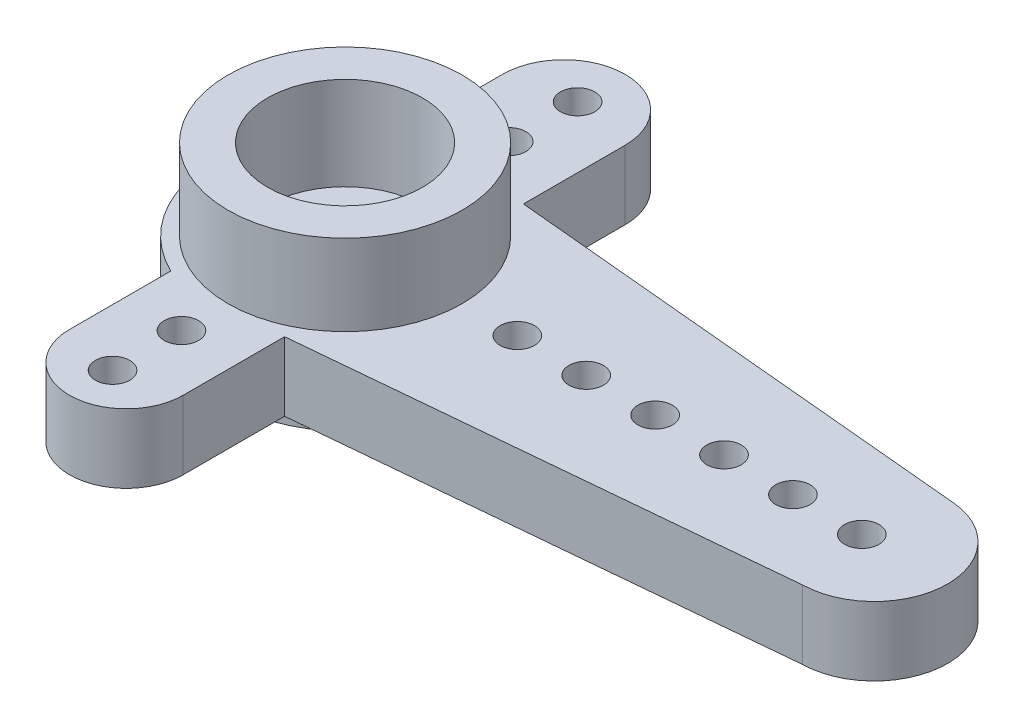
ISO-10303-21;
HEADER;
FILE_DESCRIPTION(('STEP AP214'),'2;1');
FILE_NAME('part.step','',(''),(''),'','','');
FILE_SCHEMA(('AUTOMOTIVE_DESIGN { 1 0 10303 214 1 1 1 1 }'));
ENDSEC;
DATA;
#1=APPLICATION_CONTEXT('core data for automotive mechanical design processes');
#2=APPLICATION_PROTOCOL_DEFINITION('international standard','automotive_design',2000,#1);
#3=PRODUCT_CONTEXT('',#1,'mechanical');
#4=PRODUCT('Part','Part','',(#3));
#5=PRODUCT_RELATED_PRODUCT_CATEGORY('part','',(#4));
#6=PRODUCT_DEFINITION_FORMATION('','',#4);
#7=PRODUCT_DEFINITION_CONTEXT('part definition',#1,'design');
#8=PRODUCT_DEFINITION('design','',#6,#7);
#9=PRODUCT_DEFINITION_SHAPE('','',#8);
#10=(LENGTH_UNIT() NAMED_UNIT(*) SI_UNIT(.MILLI.,.METRE.));
#11=(NAMED_UNIT(*) PLANE_ANGLE_UNIT() SI_UNIT($,.RADIAN.));
#12=(NAMED_UNIT(*) SI_UNIT($,.STERADIAN.) SOLID_ANGLE_UNIT());
#13=UNCERTAINTY_MEASURE_WITH_UNIT(LENGTH_MEASURE(1.E-05),#10,'distance_accuracy_value','');
#14=(GEOMETRIC_REPRESENTATION_CONTEXT(3) GLOBAL_UNCERTAINTY_ASSIGNED_CONTEXT((#13)) GLOBAL_UNIT_ASSIGNED_CONTEXT((#10,
#11,#12)) REPRESENTATION_CONTEXT('',''));
#15=CARTESIAN_POINT('',(0.,0.,0.));
#16=DIRECTION('',(0.,0.,1.));
#17=DIRECTION('',(1.,0.,0.));
#18=AXIS2_PLACEMENT_3D('',#15,#16,#17);
#19=CARTESIAN_POINT('',(0.,4.85,0.));
#20=DIRECTION('',(0.,-1.,0.));
#21=DIRECTION('',(0.,0.,-1.));
#22=AXIS2_PLACEMENT_3D('',#19,#20,#21);
#23=CYLINDRICAL_SURFACE('',#22,2.25);
#24=CARTESIAN_POINT('',(0.,0.,0.));
#25=DIRECTION('',(0.,1.,0.));
#26=DIRECTION('',(0.,0.,1.));
#27=AXIS2_PLACEMENT_3D('',#24,#25,#26);
#28=CIRCLE('',#27,2.25);
#29=CARTESIAN_POINT('',(0.,0.,2.25));
#30=VERTEX_POINT('',#29);
#31=EDGE_CURVE('E191',#30,#30,#28,.T.);
#32=ORIENTED_EDGE('',*,*,#31,.F.);
#33=EDGE_LOOP('',(#32));
#34=FACE_BOUND('',#33,.T.);
#35=CARTESIAN_POINT('',(0.,1.25,0.));
#36=DIRECTION('',(0.,1.,0.));
#37=DIRECTION('',(0.,0.,1.));
#38=AXIS2_PLACEMENT_3D('',#35,#36,#37);
#39=CIRCLE('',#38,2.25);
#40=CARTESIAN_POINT('',(0.,1.25,2.25));
#41=VERTEX_POINT('',#40);
#42=EDGE_CURVE('E217',#41,#41,#39,.T.);
#43=ORIENTED_EDGE('',*,*,#42,.T.);
#44=EDGE_LOOP('',(#43));
#45=FACE_BOUND('',#44,.T.);
#46=ADVANCED_FACE('F34',(#34,#45),#23,.F.);
#47=CARTESIAN_POINT('',(0.,4.85,0.));
#48=DIRECTION('',(0.,-1.,0.));
#49=DIRECTION('',(0.,0.,-1.));
#50=AXIS2_PLACEMENT_3D('',#47,#48,#49);
#51=CYLINDRICAL_SURFACE('',#50,3.4);
#52=CARTESIAN_POINT('',(0.,0.,0.));
#53=DIRECTION('',(0.,1.,0.));
#54=DIRECTION('',(0.,0.,1.));
#55=AXIS2_PLACEMENT_3D('',#52,#53,#54);
#56=CIRCLE('',#55,3.4);
#57=CARTESIAN_POINT('',(0.,0.,3.4));
#58=VERTEX_POINT('',#57);
#59=EDGE_CURVE('E195',#58,#58,#56,.T.);
#60=ORIENTED_EDGE('',*,*,#59,.T.);
#61=EDGE_LOOP('',(#60));
#62=FACE_BOUND('',#61,.T.);
#63=CARTESIAN_POINT('',(0.,0.5,0.));
#64=DIRECTION('',(0.,1.,0.));
#65=DIRECTION('',(0.,0.,1.));
#66=AXIS2_PLACEMENT_3D('',#63,#64,#65);
#67=CIRCLE('',#66,3.4);
#68=CARTESIAN_POINT('',(0.,0.5,3.4));
#69=VERTEX_POINT('',#68);
#70=EDGE_CURVE('E43',#69,#69,#67,.T.);
#71=ORIENTED_EDGE('',*,*,#70,.F.);
#72=EDGE_LOOP('',(#71));
#73=FACE_BOUND('',#72,.T.);
#74=ADVANCED_FACE('F202',(#62,#73),#51,.T.);
#75=CARTESIAN_POINT('',(0.,4.85,0.));
#76=DIRECTION('',(0.,1.,0.));
#77=DIRECTION('',(0.,0.,1.));
#78=AXIS2_PLACEMENT_3D('',#75,#76,#77);
#79=PLANE('',#78);
#80=CARTESIAN_POINT('',(0.,4.85,0.));
#81=DIRECTION('',(0.,1.,0.));
#82=DIRECTION('',(0.,0.,1.));
#83=AXIS2_PLACEMENT_3D('',#80,#81,#82);
#84=CIRCLE('',#83,3.4);
#85=CARTESIAN_POINT('',(0.,4.85,3.4));
#86=VERTEX_POINT('',#85);
#87=EDGE_CURVE('E188',#86,#86,#84,.T.);
#88=ORIENTED_EDGE('',*,*,#87,.T.);
#89=EDGE_LOOP('',(#88));
#90=FACE_BOUND('',#89,.T.);
#91=CARTESIAN_POINT('',(0.,4.85,0.));
#92=DIRECTION('',(0.,1.,0.));
#93=DIRECTION('',(0.,0.,1.));
#94=AXIS2_PLACEMENT_3D('',#91,#92,#93);
#95=CIRCLE('',#94,2.25);
#96=CARTESIAN_POINT('',(0.,4.85,2.25));
#97=VERTEX_POINT('',#96);
#98=EDGE_CURVE('E192',#97,#97,#95,.T.);
#99=ORIENTED_EDGE('',*,*,#98,.F.);
#100=EDGE_LOOP('',(#99));
#101=FACE_BOUND('',#100,.T.);
#102=ADVANCED_FACE('F208',(#90,#101),#79,.T.);
#103=CARTESIAN_POINT('',(0.,0.,0.));
#104=DIRECTION('',(0.,1.,0.));
#105=DIRECTION('',(0.,0.,1.));
#106=AXIS2_PLACEMENT_3D('',#103,#104,#105);
#107=PLANE('',#106);
#108=ORIENTED_EDGE('',*,*,#59,.F.);
#109=EDGE_LOOP('',(#108));
#110=FACE_BOUND('',#109,.T.);
#111=ORIENTED_EDGE('',*,*,#31,.T.);
#112=EDGE_LOOP('',(#111));
#113=FACE_BOUND('',#112,.T.);
#114=ADVANCED_FACE('F205',(#110,#113),#107,.F.);
#115=CARTESIAN_POINT('',(0.,2.5,0.));
#116=DIRECTION('',(0.,1.,0.));
#117=DIRECTION('',(0.,0.,1.));
#118=AXIS2_PLACEMENT_3D('',#115,#116,#117);
#119=CIRCLE('',#118,3.4);
#120=CARTESIAN_POINT('',(0.,2.5,3.4));
#121=VERTEX_POINT('',#120);
#122=EDGE_CURVE('E185',#121,#121,#119,.T.);
#123=ORIENTED_EDGE('',*,*,#122,.T.);
#124=EDGE_LOOP('',(#123));
#125=FACE_BOUND('',#124,.T.);
#126=ORIENTED_EDGE('',*,*,#87,.F.);
#127=EDGE_LOOP('',(#126));
#128=FACE_BOUND('',#127,.T.);
#129=ADVANCED_FACE('F36',(#125,#128),#51,.T.);
#130=CARTESIAN_POINT('',(0.,2.15,0.));
#131=DIRECTION('',(0.,1.,0.));
#132=DIRECTION('',(0.,0.,1.));
#133=AXIS2_PLACEMENT_3D('',#130,#131,#132);
#134=CIRCLE('',#133,2.25);
#135=CARTESIAN_POINT('',(0.,2.15,2.25));
#136=VERTEX_POINT('',#135);
#137=EDGE_CURVE('E11',#136,#136,#134,.T.);
#138=ORIENTED_EDGE('',*,*,#137,.F.);
#139=EDGE_LOOP('',(#138));
#140=FACE_BOUND('',#139,.T.);
#141=ORIENTED_EDGE('',*,*,#98,.T.);
#142=EDGE_LOOP('',(#141));
#143=FACE_BOUND('',#142,.T.);
#144=ADVANCED_FACE('F214',(#140,#143),#23,.F.);
#145=CARTESIAN_POINT('',(0.,2.5,-6.34999999965378));
#146=DIRECTION('',(0.,1.,0.));
#147=DIRECTION('',(0.,0.,1.));
#148=AXIS2_PLACEMENT_3D('',#145,#146,#147);
#149=PLANE('',#148);
#150=CARTESIAN_POINT('',(0.,2.5,-4.75));
#151=DIRECTION('',(0.,1.,0.));
#152=DIRECTION('',(0.,0.,1.));
#153=AXIS2_PLACEMENT_3D('',#150,#151,#152);
#154=CIRCLE('',#153,0.500000000000001);
#155=CARTESIAN_POINT('',(0.,2.5,-4.25));
#156=VERTEX_POINT('',#155);
#157=EDGE_CURVE('E223',#156,#156,#154,.T.);
#158=ORIENTED_EDGE('',*,*,#157,.F.);
#159=EDGE_LOOP('',(#158));
#160=FACE_BOUND('',#159,.T.);
#161=CARTESIAN_POINT('',(5.,2.5,0.));
#162=DIRECTION('',(0.,1.,0.));
#163=DIRECTION('',(0.,0.,1.));
#164=AXIS2_PLACEMENT_3D('',#161,#162,#163);
#165=CIRCLE('',#164,0.5);
#166=CARTESIAN_POINT('',(5.,2.5,0.5));
#167=VERTEX_POINT('',#166);
#168=EDGE_CURVE('E239',#167,#167,#165,.T.);
#169=ORIENTED_EDGE('',*,*,#168,.F.);
#170=EDGE_LOOP('',(#169));
#171=FACE_BOUND('',#170,.T.);
#172=CARTESIAN_POINT('',(9.,2.5,0.));
#173=DIRECTION('',(0.,1.,0.));
#174=DIRECTION('',(0.,0.,1.));
#175=AXIS2_PLACEMENT_3D('',#172,#173,#174);
#176=CIRCLE('',#175,0.500000000000001);
#177=CARTESIAN_POINT('',(9.,2.5,0.500000000000001));
#178=VERTEX_POINT('',#177);
#179=EDGE_CURVE('E251',#178,#178,#176,.T.);
#180=ORIENTED_EDGE('',*,*,#179,.F.);
#181=EDGE_LOOP('',(#180));
#182=FACE_BOUND('',#181,.T.);
#183=CARTESIAN_POINT('',(13.,2.5,0.));
#184=DIRECTION('',(0.,1.,0.));
#185=DIRECTION('',(0.,0.,1.));
#186=AXIS2_PLACEMENT_3D('',#183,#184,#185);
#187=CIRCLE('',#186,0.500000000000001);
#188=CARTESIAN_POINT('',(13.,2.5,0.500000000000001));
#189=VERTEX_POINT('',#188);
#190=EDGE_CURVE('E263',#189,#189,#187,.T.);
#191=ORIENTED_EDGE('',*,*,#190,.F.);
#192=EDGE_LOOP('',(#191));
#193=FACE_BOUND('',#192,.T.);
#194=CARTESIAN_POINT('',(0.,2.5,4.75));
#195=DIRECTION('',(0.,1.,0.));
#196=DIRECTION('',(0.,0.,1.));
#197=AXIS2_PLACEMENT_3D('',#194,#195,#196);
#198=CIRCLE('',#197,0.499999999999999);
#199=CARTESIAN_POINT('',(0.,2.5,5.25));
#200=VERTEX_POINT('',#199);
#201=EDGE_CURVE('E275',#200,#200,#198,.T.);
#202=ORIENTED_EDGE('',*,*,#201,.F.);
#203=EDGE_LOOP('',(#202));
#204=FACE_BOUND('',#203,.T.);
#205=DIRECTION('',(-0.995750277965278,0.,-0.0920944294301901));
#206=VECTOR('',#205,1.);
#207=CARTESIAN_POINT('',(15.5575588888449,2.5,-2.12174481165313));
#208=LINE('',#207,#206);
#209=CARTESIAN_POINT('',(15.5575588888449,2.5,-2.12174481165313));
#210=VERTEX_POINT('',#209);
#211=CARTESIAN_POINT('',(1.78100001074872,2.5,-3.39590396326517));
#212=VERTEX_POINT('',#211);
#213=EDGE_CURVE('E164',#210,#212,#208,.T.);
#214=ORIENTED_EDGE('',*,*,#213,.T.);
#215=DIRECTION('',(0.,0.,-1.));
#216=VECTOR('',#215,1.);
#217=CARTESIAN_POINT('',(1.78100001074872,2.5,-3.39590396326517));
#218=LINE('',#217,#216);
#219=CARTESIAN_POINT('',(1.78100001074872,2.5,-6.34999999965378));
#220=VERTEX_POINT('',#219);
#221=EDGE_CURVE('E101',#212,#220,#218,.T.);
#222=ORIENTED_EDGE('',*,*,#221,.T.);
#223=CARTESIAN_POINT('',(0.,2.5,-6.34999999965378));
#224=DIRECTION('',(0.,1.,0.));
#225=DIRECTION('',(0.,0.,1.));
#226=AXIS2_PLACEMENT_3D('',#223,#224,#225);
#227=CIRCLE('',#226,1.78100001074871);
#228=CARTESIAN_POINT('',(-1.78100001074871,2.5,-6.34999999965378));
#229=VERTEX_POINT('',#228);
#230=EDGE_CURVE('E287',#220,#229,#227,.T.);
#231=ORIENTED_EDGE('',*,*,#230,.T.);
#232=DIRECTION('',(0.,0.,1.));
#233=VECTOR('',#232,1.);
#234=CARTESIAN_POINT('',(-1.78100001074871,2.5,-6.34999999965378));
#235=LINE('',#234,#233);
#236=CARTESIAN_POINT('',(-1.78100001074871,2.5,-3.34213058763003));
#237=VERTEX_POINT('',#236);
#238=EDGE_CURVE('E289',#229,#237,#235,.T.);
#239=ORIENTED_EDGE('',*,*,#238,.T.);
#240=CARTESIAN_POINT('',(0.,2.5,0.));
#241=DIRECTION('',(0.,1.,0.));
#242=DIRECTION('',(0.,0.,1.));
#243=AXIS2_PLACEMENT_3D('',#240,#241,#242);
#244=CIRCLE('',#243,3.7870566279182);
#245=CARTESIAN_POINT('',(-1.65175893843652,2.5,3.40785714377147));
#246=VERTEX_POINT('',#245);
#247=EDGE_CURVE('E291',#237,#246,#244,.T.);
#248=ORIENTED_EDGE('',*,*,#247,.T.);
#249=DIRECTION('',(0.,0.,1.));
#250=VECTOR('',#249,1.);
#251=CARTESIAN_POINT('',(-1.65175893843652,2.5,3.40785714377147));
#252=LINE('',#251,#250);
#253=CARTESIAN_POINT('',(-1.65175893843652,2.5,6.35000000018459));
#254=VERTEX_POINT('',#253);
#255=EDGE_CURVE('E293',#246,#254,#252,.T.);
#256=ORIENTED_EDGE('',*,*,#255,.T.);
#257=CARTESIAN_POINT('',(0.,2.5,6.35000000018459));
#258=DIRECTION('',(0.,1.,0.));
#259=DIRECTION('',(0.,0.,1.));
#260=AXIS2_PLACEMENT_3D('',#257,#258,#259);
#261=CIRCLE('',#260,1.65175893843652);
#262=CARTESIAN_POINT('',(1.65175893843652,2.5,6.35000000018459));
#263=VERTEX_POINT('',#262);
#264=EDGE_CURVE('E127',#254,#263,#261,.T.);
#265=ORIENTED_EDGE('',*,*,#264,.T.);
#266=DIRECTION('',(0.,0.,-1.));
#267=VECTOR('',#266,1.);
#268=CARTESIAN_POINT('',(1.65175893843652,2.5,6.35000000018459));
#269=LINE('',#268,#267);
#270=CARTESIAN_POINT('',(1.65175893843652,2.5,3.40785714377443));
#271=VERTEX_POINT('',#270);
#272=EDGE_CURVE('E120',#263,#271,#269,.T.);
#273=ORIENTED_EDGE('',*,*,#272,.T.);
#274=DIRECTION('',(0.995716456663752,0.,-0.0924593852942015));
#275=VECTOR('',#274,1.);
#276=CARTESIAN_POINT('',(1.65175893843652,2.5,3.40785714377443));
#277=LINE('',#276,#275);
#278=CARTESIAN_POINT('',(15.4101118560695,2.5,2.13029580097279));
#279=VERTEX_POINT('',#278);
#280=EDGE_CURVE('E125',#271,#279,#277,.T.);
#281=ORIENTED_EDGE('',*,*,#280,.T.);
#282=CARTESIAN_POINT('',(15.3605397279939,2.5,5.66950999388482E-13));
#283=DIRECTION('',(0.,1.,0.));
#284=DIRECTION('',(0.,0.,1.));
#285=AXIS2_PLACEMENT_3D('',#282,#283,#284);
#286=CIRCLE('',#285,2.13087249630799);
#287=EDGE_CURVE('E51',#279,#210,#286,.T.);
#288=ORIENTED_EDGE('',*,*,#287,.T.);
#289=EDGE_LOOP('',(#214,#222,#231,#239,#248,#256,#265,#273,#281,#288));
#290=FACE_BOUND('',#289,.T.);
#291=CARTESIAN_POINT('',(0.,2.5,6.75));
#292=DIRECTION('',(0.,1.,0.));
#293=DIRECTION('',(0.,0.,1.));
#294=AXIS2_PLACEMENT_3D('',#291,#292,#293);
#295=CIRCLE('',#294,0.500000000000001);
#296=CARTESIAN_POINT('',(0.,2.5,7.25));
#297=VERTEX_POINT('',#296);
#298=EDGE_CURVE('E149',#297,#297,#295,.T.);
#299=ORIENTED_EDGE('',*,*,#298,.F.);
#300=EDGE_LOOP('',(#299));
#301=FACE_BOUND('',#300,.T.);
#302=CARTESIAN_POINT('',(15.,2.5,0.));
#303=DIRECTION('',(0.,1.,0.));
#304=DIRECTION('',(0.,0.,1.));
#305=AXIS2_PLACEMENT_3D('',#302,#303,#304);
#306=CIRCLE('',#305,0.499999999999999);
#307=CARTESIAN_POINT('',(15.,2.5,0.499999999999999));
#308=VERTEX_POINT('',#307);
#309=EDGE_CURVE('E269',#308,#308,#306,.T.);
#310=ORIENTED_EDGE('',*,*,#309,.F.);
#311=EDGE_LOOP('',(#310));
#312=FACE_BOUND('',#311,.T.);
#313=CARTESIAN_POINT('',(11.,2.5,0.));
#314=DIRECTION('',(0.,1.,0.));
#315=DIRECTION('',(0.,0.,1.));
#316=AXIS2_PLACEMENT_3D('',#313,#314,#315);
#317=CIRCLE('',#316,0.500000000000001);
#318=CARTESIAN_POINT('',(11.,2.5,0.500000000000001));
#319=VERTEX_POINT('',#318);
#320=EDGE_CURVE('E257',#319,#319,#317,.T.);
#321=ORIENTED_EDGE('',*,*,#320,.F.);
#322=EDGE_LOOP('',(#321));
#323=FACE_BOUND('',#322,.T.);
#324=CARTESIAN_POINT('',(7.,2.5,0.));
#325=DIRECTION('',(0.,1.,0.));
#326=DIRECTION('',(0.,0.,1.));
#327=AXIS2_PLACEMENT_3D('',#324,#325,#326);
#328=CIRCLE('',#327,0.5);
#329=CARTESIAN_POINT('',(7.,2.5,0.5));
#330=VERTEX_POINT('',#329);
#331=EDGE_CURVE('E245',#330,#330,#328,.T.);
#332=ORIENTED_EDGE('',*,*,#331,.F.);
#333=EDGE_LOOP('',(#332));
#334=FACE_BOUND('',#333,.T.);
#335=CARTESIAN_POINT('',(0.,2.5,-6.75));
#336=DIRECTION('',(0.,1.,0.));
#337=DIRECTION('',(0.,0.,1.));
#338=AXIS2_PLACEMENT_3D('',#335,#336,#337);
#339=CIRCLE('',#338,0.499999999999999);
#340=CARTESIAN_POINT('',(0.,2.5,-6.25));
#341=VERTEX_POINT('',#340);
#342=EDGE_CURVE('E233',#341,#341,#339,.T.);
#343=ORIENTED_EDGE('',*,*,#342,.F.);
#344=EDGE_LOOP('',(#343));
#345=FACE_BOUND('',#344,.T.);
#346=ORIENTED_EDGE('',*,*,#122,.F.);
#347=EDGE_LOOP('',(#346));
#348=FACE_BOUND('',#347,.T.);
#349=ADVANCED_FACE('F122',(#160,#171,#182,#193,#204,#290,#301,#312,#323,#334,#345,#348),#149,.T.);
#350=CARTESIAN_POINT('',(0.,0.5,-6.34999999965378));
#351=DIRECTION('',(0.,1.,0.));
#352=DIRECTION('',(0.,0.,1.));
#353=AXIS2_PLACEMENT_3D('',#350,#351,#352);
#354=PLANE('',#353);
#355=CARTESIAN_POINT('',(0.,0.5,-4.75));
#356=DIRECTION('',(0.,1.,0.));
#357=DIRECTION('',(0.,0.,1.));
#358=AXIS2_PLACEMENT_3D('',#355,#356,#357);
#359=CIRCLE('',#358,0.500000000000001);
#360=CARTESIAN_POINT('',(0.,0.5,-4.25));
#361=VERTEX_POINT('',#360);
#362=EDGE_CURVE('E219',#361,#361,#359,.T.);
#363=ORIENTED_EDGE('',*,*,#362,.T.);
#364=EDGE_LOOP('',(#363));
#365=FACE_BOUND('',#364,.T.);
#366=CARTESIAN_POINT('',(0.,0.5,-6.75));
#367=DIRECTION('',(0.,1.,0.));
#368=DIRECTION('',(0.,0.,1.));
#369=AXIS2_PLACEMENT_3D('',#366,#367,#368);
#370=CIRCLE('',#369,0.499999999999999);
#371=CARTESIAN_POINT('',(0.,0.5,-6.25));
#372=VERTEX_POINT('',#371);
#373=EDGE_CURVE('E231',#372,#372,#370,.T.);
#374=ORIENTED_EDGE('',*,*,#373,.T.);
#375=EDGE_LOOP('',(#374));
#376=FACE_BOUND('',#375,.T.);
#377=CARTESIAN_POINT('',(5.,0.5,0.));
#378=DIRECTION('',(0.,1.,0.));
#379=DIRECTION('',(0.,0.,1.));
#380=AXIS2_PLACEMENT_3D('',#377,#378,#379);
#381=CIRCLE('',#380,0.5);
#382=CARTESIAN_POINT('',(5.,0.5,0.5));
#383=VERTEX_POINT('',#382);
#384=EDGE_CURVE('E236',#383,#383,#381,.T.);
#385=ORIENTED_EDGE('',*,*,#384,.T.);
#386=EDGE_LOOP('',(#385));
#387=FACE_BOUND('',#386,.T.);
#388=CARTESIAN_POINT('',(7.,0.5,0.));
#389=DIRECTION('',(0.,1.,0.));
#390=DIRECTION('',(0.,0.,1.));
#391=AXIS2_PLACEMENT_3D('',#388,#389,#390);
#392=CIRCLE('',#391,0.5);
#393=CARTESIAN_POINT('',(7.,0.5,0.5));
#394=VERTEX_POINT('',#393);
#395=EDGE_CURVE('E242',#394,#394,#392,.T.);
#396=ORIENTED_EDGE('',*,*,#395,.T.);
#397=EDGE_LOOP('',(#396));
#398=FACE_BOUND('',#397,.T.);
#399=CARTESIAN_POINT('',(9.,0.5,0.));
#400=DIRECTION('',(0.,1.,0.));
#401=DIRECTION('',(0.,0.,1.));
#402=AXIS2_PLACEMENT_3D('',#399,#400,#401);
#403=CIRCLE('',#402,0.500000000000001);
#404=CARTESIAN_POINT('',(9.,0.5,0.500000000000001));
#405=VERTEX_POINT('',#404);
#406=EDGE_CURVE('E248',#405,#405,#403,.T.);
#407=ORIENTED_EDGE('',*,*,#406,.T.);
#408=EDGE_LOOP('',(#407));
#409=FACE_BOUND('',#408,.T.);
#410=CARTESIAN_POINT('',(11.,0.5,0.));
#411=DIRECTION('',(0.,1.,0.));
#412=DIRECTION('',(0.,0.,1.));
#413=AXIS2_PLACEMENT_3D('',#410,#411,#412);
#414=CIRCLE('',#413,0.500000000000001);
#415=CARTESIAN_POINT('',(11.,0.5,0.500000000000001));
#416=VERTEX_POINT('',#415);
#417=EDGE_CURVE('E254',#416,#416,#414,.T.);
#418=ORIENTED_EDGE('',*,*,#417,.T.);
#419=EDGE_LOOP('',(#418));
#420=FACE_BOUND('',#419,.T.);
#421=CARTESIAN_POINT('',(13.,0.5,0.));
#422=DIRECTION('',(0.,1.,0.));
#423=DIRECTION('',(0.,0.,1.));
#424=AXIS2_PLACEMENT_3D('',#421,#422,#423);
#425=CIRCLE('',#424,0.500000000000001);
#426=CARTESIAN_POINT('',(13.,0.5,0.500000000000001));
#427=VERTEX_POINT('',#426);
#428=EDGE_CURVE('E260',#427,#427,#425,.T.);
#429=ORIENTED_EDGE('',*,*,#428,.T.);
#430=EDGE_LOOP('',(#429));
#431=FACE_BOUND('',#430,.T.);
#432=CARTESIAN_POINT('',(15.,0.5,0.));
#433=DIRECTION('',(0.,1.,0.));
#434=DIRECTION('',(0.,0.,1.));
#435=AXIS2_PLACEMENT_3D('',#432,#433,#434);
#436=CIRCLE('',#435,0.499999999999999);
#437=CARTESIAN_POINT('',(15.,0.5,0.499999999999999));
#438=VERTEX_POINT('',#437);
#439=EDGE_CURVE('E266',#438,#438,#436,.T.);
#440=ORIENTED_EDGE('',*,*,#439,.T.);
#441=EDGE_LOOP('',(#440));
#442=FACE_BOUND('',#441,.T.);
#443=CARTESIAN_POINT('',(0.,0.5,4.75));
#444=DIRECTION('',(0.,1.,0.));
#445=DIRECTION('',(0.,0.,1.));
#446=AXIS2_PLACEMENT_3D('',#443,#444,#445);
#447=CIRCLE('',#446,0.499999999999999);
#448=CARTESIAN_POINT('',(0.,0.5,5.25));
#449=VERTEX_POINT('',#448);
#450=EDGE_CURVE('E272',#449,#449,#447,.T.);
#451=ORIENTED_EDGE('',*,*,#450,.T.);
#452=EDGE_LOOP('',(#451));
#453=FACE_BOUND('',#452,.T.);
#454=CARTESIAN_POINT('',(0.,0.5,6.75));
#455=DIRECTION('',(0.,1.,0.));
#456=DIRECTION('',(0.,0.,1.));
#457=AXIS2_PLACEMENT_3D('',#454,#455,#456);
#458=CIRCLE('',#457,0.500000000000001);
#459=CARTESIAN_POINT('',(0.,0.5,7.25));
#460=VERTEX_POINT('',#459);
#461=EDGE_CURVE('E278',#460,#460,#458,.T.);
#462=ORIENTED_EDGE('',*,*,#461,.T.);
#463=EDGE_LOOP('',(#462));
#464=FACE_BOUND('',#463,.T.);
#465=DIRECTION('',(-0.995750277965278,0.,-0.0920944294301901));
#466=VECTOR('',#465,1.);
#467=CARTESIAN_POINT('',(15.5575588888449,0.5,-2.12174481165313));
#468=LINE('',#467,#466);
#469=CARTESIAN_POINT('',(15.5575588888449,0.5,-2.12174481165313));
#470=VERTEX_POINT('',#469);
#471=CARTESIAN_POINT('',(1.78100001074872,0.5,-3.39590396326517));
#472=VERTEX_POINT('',#471);
#473=EDGE_CURVE('E145',#470,#472,#468,.T.);
#474=ORIENTED_EDGE('',*,*,#473,.F.);
#475=CARTESIAN_POINT('',(15.3605397279939,0.5,5.66950999388482E-13));
#476=DIRECTION('',(0.,1.,0.));
#477=DIRECTION('',(0.,0.,1.));
#478=AXIS2_PLACEMENT_3D('',#475,#476,#477);
#479=CIRCLE('',#478,2.13087249630799);
#480=CARTESIAN_POINT('',(15.4101118560695,0.5,2.13029580097279));
#481=VERTEX_POINT('',#480);
#482=EDGE_CURVE('E92',#481,#470,#479,.T.);
#483=ORIENTED_EDGE('',*,*,#482,.F.);
#484=DIRECTION('',(0.995716456663752,0.,-0.0924593852942015));
#485=VECTOR('',#484,1.);
#486=CARTESIAN_POINT('',(1.65175893843652,0.5,3.40785714377443));
#487=LINE('',#486,#485);
#488=CARTESIAN_POINT('',(1.65175893843652,0.5,3.40785714377443));
#489=VERTEX_POINT('',#488);
#490=EDGE_CURVE('E86',#489,#481,#487,.T.);
#491=ORIENTED_EDGE('',*,*,#490,.F.);
#492=DIRECTION('',(0.,0.,-1.));
#493=VECTOR('',#492,1.);
#494=CARTESIAN_POINT('',(1.65175893843652,0.5,6.35000000018459));
#495=LINE('',#494,#493);
#496=CARTESIAN_POINT('',(1.65175893843652,0.5,6.35000000018459));
#497=VERTEX_POINT('',#496);
#498=EDGE_CURVE('E135',#497,#489,#495,.T.);
#499=ORIENTED_EDGE('',*,*,#498,.F.);
#500=CARTESIAN_POINT('',(0.,0.5,6.35000000018459));
#501=DIRECTION('',(0.,1.,0.));
#502=DIRECTION('',(0.,0.,1.));
#503=AXIS2_PLACEMENT_3D('',#500,#501,#502);
#504=CIRCLE('',#503,1.65175893843652);
#505=CARTESIAN_POINT('',(-1.65175893843652,0.5,6.35000000018459));
#506=VERTEX_POINT('',#505);
#507=EDGE_CURVE('E159',#506,#497,#504,.T.);
#508=ORIENTED_EDGE('',*,*,#507,.F.);
#509=DIRECTION('',(0.,0.,1.));
#510=VECTOR('',#509,1.);
#511=CARTESIAN_POINT('',(-1.65175893843652,0.5,3.40785714377147));
#512=LINE('',#511,#510);
#513=CARTESIAN_POINT('',(-1.65175893843652,0.5,3.40785714377147));
#514=VERTEX_POINT('',#513);
#515=EDGE_CURVE('E157',#514,#506,#512,.T.);
#516=ORIENTED_EDGE('',*,*,#515,.F.);
#517=CARTESIAN_POINT('',(0.,0.5,0.));
#518=DIRECTION('',(0.,1.,0.));
#519=DIRECTION('',(0.,0.,1.));
#520=AXIS2_PLACEMENT_3D('',#517,#518,#519);
#521=CIRCLE('',#520,3.7870566279182);
#522=CARTESIAN_POINT('',(-1.78100001074871,0.5,-3.34213058763003));
#523=VERTEX_POINT('',#522);
#524=EDGE_CURVE('E155',#523,#514,#521,.T.);
#525=ORIENTED_EDGE('',*,*,#524,.F.);
#526=DIRECTION('',(0.,0.,1.));
#527=VECTOR('',#526,1.);
#528=CARTESIAN_POINT('',(-1.78100001074871,0.5,-6.34999999965378));
#529=LINE('',#528,#527);
#530=CARTESIAN_POINT('',(-1.78100001074871,0.5,-6.34999999965378));
#531=VERTEX_POINT('',#530);
#532=EDGE_CURVE('E153',#531,#523,#529,.T.);
#533=ORIENTED_EDGE('',*,*,#532,.F.);
#534=CARTESIAN_POINT('',(0.,0.5,-6.34999999965378));
#535=DIRECTION('',(0.,1.,0.));
#536=DIRECTION('',(0.,0.,1.));
#537=AXIS2_PLACEMENT_3D('',#534,#535,#536);
#538=CIRCLE('',#537,1.78100001074871);
#539=CARTESIAN_POINT('',(1.78100001074872,0.5,-6.34999999965378));
#540=VERTEX_POINT('',#539);
#541=EDGE_CURVE('E151',#540,#531,#538,.T.);
#542=ORIENTED_EDGE('',*,*,#541,.F.);
#543=DIRECTION('',(0.,0.,-1.));
#544=VECTOR('',#543,1.);
#545=CARTESIAN_POINT('',(1.78100001074872,0.5,-3.39590396326517));
#546=LINE('',#545,#544);
#547=EDGE_CURVE('E148',#472,#540,#546,.T.);
#548=ORIENTED_EDGE('',*,*,#547,.F.);
#549=EDGE_LOOP('',(#474,#483,#491,#499,#508,#516,#525,#533,#542,#548));
#550=FACE_BOUND('',#549,.T.);
#551=ORIENTED_EDGE('',*,*,#70,.T.);
#552=EDGE_LOOP('',(#551));
#553=FACE_BOUND('',#552,.T.);
#554=ADVANCED_FACE('F306',(#365,#376,#387,#398,#409,#420,#431,#442,#453,#464,#550,#553),#354,.F.);
#555=CARTESIAN_POINT('',(15.5575588888449,2.5,-2.12174481165313));
#556=DIRECTION('',(-0.0920944294301901,0.,0.995750277965278));
#557=DIRECTION('',(0.995750277965278,0.,0.0920944294301901));
#558=AXIS2_PLACEMENT_3D('',#555,#556,#557);
#559=PLANE('',#558);
#560=ORIENTED_EDGE('',*,*,#473,.T.);
#561=DIRECTION('',(0.,-1.,0.));
#562=VECTOR('',#561,1.);
#563=CARTESIAN_POINT('',(1.78100001074872,2.5,-3.39590396326517));
#564=LINE('',#563,#562);
#565=EDGE_CURVE('E183',#212,#472,#564,.T.);
#566=ORIENTED_EDGE('',*,*,#565,.F.);
#567=ORIENTED_EDGE('',*,*,#213,.F.);
#568=DIRECTION('',(0.,-1.,0.));
#569=VECTOR('',#568,1.);
#570=CARTESIAN_POINT('',(15.5575588888449,2.5,-2.12174481165313));
#571=LINE('',#570,#569);
#572=EDGE_CURVE('E141',#210,#470,#571,.T.);
#573=ORIENTED_EDGE('',*,*,#572,.T.);
#574=EDGE_LOOP('',(#560,#566,#567,#573));
#575=FACE_BOUND('',#574,.T.);
#576=ADVANCED_FACE('F311',(#575),#559,.F.);
#577=CARTESIAN_POINT('',(1.78100001074872,2.5,-3.39590396326517));
#578=DIRECTION('',(-1.,0.,0.));
#579=DIRECTION('',(0.,0.,1.));
#580=AXIS2_PLACEMENT_3D('',#577,#578,#579);
#581=PLANE('',#580);
#582=ORIENTED_EDGE('',*,*,#547,.T.);
#583=DIRECTION('',(0.,-1.,0.));
#584=VECTOR('',#583,1.);
#585=CARTESIAN_POINT('',(1.78100001074872,2.5,-6.34999999965378));
#586=LINE('',#585,#584);
#587=EDGE_CURVE('E180',#220,#540,#586,.T.);
#588=ORIENTED_EDGE('',*,*,#587,.F.);
#589=ORIENTED_EDGE('',*,*,#221,.F.);
#590=ORIENTED_EDGE('',*,*,#565,.T.);
#591=EDGE_LOOP('',(#582,#588,#589,#590));
#592=FACE_BOUND('',#591,.T.);
#593=ADVANCED_FACE('F345',(#592),#581,.F.);
#594=CARTESIAN_POINT('',(0.,2.5,-6.34999999965378));
#595=DIRECTION('',(0.,-1.,0.));
#596=DIRECTION('',(0.,0.,-1.));
#597=AXIS2_PLACEMENT_3D('',#594,#595,#596);
#598=CYLINDRICAL_SURFACE('',#597,1.78100001074871);
#599=ORIENTED_EDGE('',*,*,#541,.T.);
#600=DIRECTION('',(0.,-1.,0.));
#601=VECTOR('',#600,1.);
#602=CARTESIAN_POINT('',(-1.78100001074871,2.5,-6.34999999965378));
#603=LINE('',#602,#601);
#604=EDGE_CURVE('E177',#229,#531,#603,.T.);
#605=ORIENTED_EDGE('',*,*,#604,.F.);
#606=ORIENTED_EDGE('',*,*,#230,.F.);
#607=ORIENTED_EDGE('',*,*,#587,.T.);
#608=EDGE_LOOP('',(#599,#605,#606,#607));
#609=FACE_BOUND('',#608,.T.);
#610=ADVANCED_FACE('F341',(#609),#598,.T.);
#611=CARTESIAN_POINT('',(-1.78100001074871,2.5,-6.34999999965378));
#612=DIRECTION('',(1.,0.,0.));
#613=DIRECTION('',(0.,0.,-1.));
#614=AXIS2_PLACEMENT_3D('',#611,#612,#613);
#615=PLANE('',#614);
#616=ORIENTED_EDGE('',*,*,#532,.T.);
#617=DIRECTION('',(0.,-1.,0.));
#618=VECTOR('',#617,1.);
#619=CARTESIAN_POINT('',(-1.78100001074871,2.5,-3.34213058763003));
#620=LINE('',#619,#618);
#621=EDGE_CURVE('E174',#237,#523,#620,.T.);
#622=ORIENTED_EDGE('',*,*,#621,.F.);
#623=ORIENTED_EDGE('',*,*,#238,.F.);
#624=ORIENTED_EDGE('',*,*,#604,.T.);
#625=EDGE_LOOP('',(#616,#622,#623,#624));
#626=FACE_BOUND('',#625,.T.);
#627=ADVANCED_FACE('F337',(#626),#615,.F.);
#628=CARTESIAN_POINT('',(0.,2.5,0.));
#629=DIRECTION('',(0.,-1.,0.));
#630=DIRECTION('',(0.,0.,-1.));
#631=AXIS2_PLACEMENT_3D('',#628,#629,#630);
#632=CYLINDRICAL_SURFACE('',#631,3.7870566279182);
#633=ORIENTED_EDGE('',*,*,#524,.T.);
#634=DIRECTION('',(0.,-1.,0.));
#635=VECTOR('',#634,1.);
#636=CARTESIAN_POINT('',(-1.65175893843652,2.5,3.40785714377147));
#637=LINE('',#636,#635);
#638=EDGE_CURVE('E171',#246,#514,#637,.T.);
#639=ORIENTED_EDGE('',*,*,#638,.F.);
#640=ORIENTED_EDGE('',*,*,#247,.F.);
#641=ORIENTED_EDGE('',*,*,#621,.T.);
#642=EDGE_LOOP('',(#633,#639,#640,#641));
#643=FACE_BOUND('',#642,.T.);
#644=ADVANCED_FACE('F334',(#643),#632,.T.);
#645=CARTESIAN_POINT('',(-1.65175893843652,2.5,3.40785714377147));
#646=DIRECTION('',(1.,0.,0.));
#647=DIRECTION('',(0.,0.,-1.));
#648=AXIS2_PLACEMENT_3D('',#645,#646,#647);
#649=PLANE('',#648);
#650=ORIENTED_EDGE('',*,*,#515,.T.);
#651=DIRECTION('',(0.,-1.,0.));
#652=VECTOR('',#651,1.);
#653=CARTESIAN_POINT('',(-1.65175893843652,2.5,6.35000000018459));
#654=LINE('',#653,#652);
#655=EDGE_CURVE('E168',#254,#506,#654,.T.);
#656=ORIENTED_EDGE('',*,*,#655,.F.);
#657=ORIENTED_EDGE('',*,*,#255,.F.);
#658=ORIENTED_EDGE('',*,*,#638,.T.);
#659=EDGE_LOOP('',(#650,#656,#657,#658));
#660=FACE_BOUND('',#659,.T.);
#661=ADVANCED_FACE('F299',(#660),#649,.F.);
#662=CARTESIAN_POINT('',(0.,2.5,6.35000000018459));
#663=DIRECTION('',(0.,-1.,0.));
#664=DIRECTION('',(0.,0.,-1.));
#665=AXIS2_PLACEMENT_3D('',#662,#663,#664);
#666=CYLINDRICAL_SURFACE('',#665,1.65175893843652);
#667=ORIENTED_EDGE('',*,*,#507,.T.);
#668=DIRECTION('',(0.,-1.,0.));
#669=VECTOR('',#668,1.);
#670=CARTESIAN_POINT('',(1.65175893843652,2.5,6.35000000018459));
#671=LINE('',#670,#669);
#672=EDGE_CURVE('E136',#263,#497,#671,.T.);
#673=ORIENTED_EDGE('',*,*,#672,.F.);
#674=ORIENTED_EDGE('',*,*,#264,.F.);
#675=ORIENTED_EDGE('',*,*,#655,.T.);
#676=EDGE_LOOP('',(#667,#673,#674,#675));
#677=FACE_BOUND('',#676,.T.);
#678=ADVANCED_FACE('F303',(#677),#666,.T.);
#679=CARTESIAN_POINT('',(1.65175893843652,2.5,6.35000000018459));
#680=DIRECTION('',(-1.,0.,0.));
#681=DIRECTION('',(0.,0.,1.));
#682=AXIS2_PLACEMENT_3D('',#679,#680,#681);
#683=PLANE('',#682);
#684=ORIENTED_EDGE('',*,*,#498,.T.);
#685=DIRECTION('',(0.,-1.,0.));
#686=VECTOR('',#685,1.);
#687=CARTESIAN_POINT('',(1.65175893843652,2.5,3.40785714377443));
#688=LINE('',#687,#686);
#689=EDGE_CURVE('E132',#271,#489,#688,.T.);
#690=ORIENTED_EDGE('',*,*,#689,.F.);
#691=ORIENTED_EDGE('',*,*,#272,.F.);
#692=ORIENTED_EDGE('',*,*,#672,.T.);
#693=EDGE_LOOP('',(#684,#690,#691,#692));
#694=FACE_BOUND('',#693,.T.);
#695=ADVANCED_FACE('F133',(#694),#683,.F.);
#696=CARTESIAN_POINT('',(1.65175893843652,2.5,3.40785714377443));
#697=DIRECTION('',(-0.0924593852942015,0.,-0.995716456663752));
#698=DIRECTION('',(-0.995716456663753,0.,0.0924593852942015));
#699=AXIS2_PLACEMENT_3D('',#696,#697,#698);
#700=PLANE('',#699);
#701=ORIENTED_EDGE('',*,*,#490,.T.);
#702=DIRECTION('',(0.,-1.,0.));
#703=VECTOR('',#702,1.);
#704=CARTESIAN_POINT('',(15.4101118560695,2.5,2.13029580097279));
#705=LINE('',#704,#703);
#706=EDGE_CURVE('E137',#279,#481,#705,.T.);
#707=ORIENTED_EDGE('',*,*,#706,.F.);
#708=ORIENTED_EDGE('',*,*,#280,.F.);
#709=ORIENTED_EDGE('',*,*,#689,.T.);
#710=EDGE_LOOP('',(#701,#707,#708,#709));
#711=FACE_BOUND('',#710,.T.);
#712=ADVANCED_FACE('F139',(#711),#700,.F.);
#713=CARTESIAN_POINT('',(15.3605397279939,2.5,5.66950999388482E-13));
#714=DIRECTION('',(0.,-1.,0.));
#715=DIRECTION('',(0.,0.,-1.));
#716=AXIS2_PLACEMENT_3D('',#713,#714,#715);
#717=CYLINDRICAL_SURFACE('',#716,2.13087249630799);
#718=ORIENTED_EDGE('',*,*,#482,.T.);
#719=ORIENTED_EDGE('',*,*,#572,.F.);
#720=ORIENTED_EDGE('',*,*,#287,.F.);
#721=ORIENTED_EDGE('',*,*,#706,.T.);
#722=EDGE_LOOP('',(#718,#719,#720,#721));
#723=FACE_BOUND('',#722,.T.);
#724=ADVANCED_FACE('F313',(#723),#717,.T.);
#725=CARTESIAN_POINT('',(0.,2.5,6.75));
#726=DIRECTION('',(0.,-1.,0.));
#727=DIRECTION('',(0.,0.,-1.));
#728=AXIS2_PLACEMENT_3D('',#725,#726,#727);
#729=CYLINDRICAL_SURFACE('',#728,0.500000000000001);
#730=ORIENTED_EDGE('',*,*,#298,.T.);
#731=EDGE_LOOP('',(#730));
#732=FACE_BOUND('',#731,.T.);
#733=ORIENTED_EDGE('',*,*,#461,.F.);
#734=EDGE_LOOP('',(#733));
#735=FACE_BOUND('',#734,.T.);
#736=ADVANCED_FACE('F315',(#732,#735),#729,.F.);
#737=CARTESIAN_POINT('',(0.,2.5,4.75));
#738=DIRECTION('',(0.,-1.,0.));
#739=DIRECTION('',(0.,0.,-1.));
#740=AXIS2_PLACEMENT_3D('',#737,#738,#739);
#741=CYLINDRICAL_SURFACE('',#740,0.499999999999999);
#742=ORIENTED_EDGE('',*,*,#201,.T.);
#743=EDGE_LOOP('',(#742));
#744=FACE_BOUND('',#743,.T.);
#745=ORIENTED_EDGE('',*,*,#450,.F.);
#746=EDGE_LOOP('',(#745));
#747=FACE_BOUND('',#746,.T.);
#748=ADVANCED_FACE('F321',(#744,#747),#741,.F.);
#749=CARTESIAN_POINT('',(15.,2.5,0.));
#750=DIRECTION('',(0.,-1.,0.));
#751=DIRECTION('',(0.,0.,-1.));
#752=AXIS2_PLACEMENT_3D('',#749,#750,#751);
#753=CYLINDRICAL_SURFACE('',#752,0.499999999999999);
#754=ORIENTED_EDGE('',*,*,#309,.T.);
#755=EDGE_LOOP('',(#754));
#756=FACE_BOUND('',#755,.T.);
#757=ORIENTED_EDGE('',*,*,#439,.F.);
#758=EDGE_LOOP('',(#757));
#759=FACE_BOUND('',#758,.T.);
#760=ADVANCED_FACE('F380',(#756,#759),#753,.F.);
#761=CARTESIAN_POINT('',(13.,2.5,0.));
#762=DIRECTION('',(0.,-1.,0.));
#763=DIRECTION('',(0.,0.,-1.));
#764=AXIS2_PLACEMENT_3D('',#761,#762,#763);
#765=CYLINDRICAL_SURFACE('',#764,0.500000000000001);
#766=ORIENTED_EDGE('',*,*,#190,.T.);
#767=EDGE_LOOP('',(#766));
#768=FACE_BOUND('',#767,.T.);
#769=ORIENTED_EDGE('',*,*,#428,.F.);
#770=EDGE_LOOP('',(#769));
#771=FACE_BOUND('',#770,.T.);
#772=ADVANCED_FACE('F384',(#768,#771),#765,.F.);
#773=CARTESIAN_POINT('',(11.,2.5,0.));
#774=DIRECTION('',(0.,-1.,0.));
#775=DIRECTION('',(0.,0.,-1.));
#776=AXIS2_PLACEMENT_3D('',#773,#774,#775);
#777=CYLINDRICAL_SURFACE('',#776,0.500000000000001);
#778=ORIENTED_EDGE('',*,*,#320,.T.);
#779=EDGE_LOOP('',(#778));
#780=FACE_BOUND('',#779,.T.);
#781=ORIENTED_EDGE('',*,*,#417,.F.);
#782=EDGE_LOOP('',(#781));
#783=FACE_BOUND('',#782,.T.);
#784=ADVANCED_FACE('F388',(#780,#783),#777,.F.);
#785=CARTESIAN_POINT('',(9.,2.5,0.));
#786=DIRECTION('',(0.,-1.,0.));
#787=DIRECTION('',(0.,0.,-1.));
#788=AXIS2_PLACEMENT_3D('',#785,#786,#787);
#789=CYLINDRICAL_SURFACE('',#788,0.500000000000001);
#790=ORIENTED_EDGE('',*,*,#179,.T.);
#791=EDGE_LOOP('',(#790));
#792=FACE_BOUND('',#791,.T.);
#793=ORIENTED_EDGE('',*,*,#406,.F.);
#794=EDGE_LOOP('',(#793));
#795=FACE_BOUND('',#794,.T.);
#796=ADVANCED_FACE('F392',(#792,#795),#789,.F.);
#797=CARTESIAN_POINT('',(7.,2.5,0.));
#798=DIRECTION('',(0.,-1.,0.));
#799=DIRECTION('',(0.,0.,-1.));
#800=AXIS2_PLACEMENT_3D('',#797,#798,#799);
#801=CYLINDRICAL_SURFACE('',#800,0.5);
#802=ORIENTED_EDGE('',*,*,#331,.T.);
#803=EDGE_LOOP('',(#802));
#804=FACE_BOUND('',#803,.T.);
#805=ORIENTED_EDGE('',*,*,#395,.F.);
#806=EDGE_LOOP('',(#805));
#807=FACE_BOUND('',#806,.T.);
#808=ADVANCED_FACE('F396',(#804,#807),#801,.F.);
#809=CARTESIAN_POINT('',(5.,2.5,0.));
#810=DIRECTION('',(0.,-1.,0.));
#811=DIRECTION('',(0.,0.,-1.));
#812=AXIS2_PLACEMENT_3D('',#809,#810,#811);
#813=CYLINDRICAL_SURFACE('',#812,0.5);
#814=ORIENTED_EDGE('',*,*,#168,.T.);
#815=EDGE_LOOP('',(#814));
#816=FACE_BOUND('',#815,.T.);
#817=ORIENTED_EDGE('',*,*,#384,.F.);
#818=EDGE_LOOP('',(#817));
#819=FACE_BOUND('',#818,.T.);
#820=ADVANCED_FACE('F400',(#816,#819),#813,.F.);
#821=CARTESIAN_POINT('',(0.,2.5,-6.75));
#822=DIRECTION('',(0.,-1.,0.));
#823=DIRECTION('',(0.,0.,-1.));
#824=AXIS2_PLACEMENT_3D('',#821,#822,#823);
#825=CYLINDRICAL_SURFACE('',#824,0.499999999999999);
#826=ORIENTED_EDGE('',*,*,#342,.T.);
#827=EDGE_LOOP('',(#826));
#828=FACE_BOUND('',#827,.T.);
#829=ORIENTED_EDGE('',*,*,#373,.F.);
#830=EDGE_LOOP('',(#829));
#831=FACE_BOUND('',#830,.T.);
#832=ADVANCED_FACE('F404',(#828,#831),#825,.F.);
#833=CARTESIAN_POINT('',(0.,2.5,-4.75));
#834=DIRECTION('',(0.,-1.,0.));
#835=DIRECTION('',(0.,0.,-1.));
#836=AXIS2_PLACEMENT_3D('',#833,#834,#835);
#837=CYLINDRICAL_SURFACE('',#836,0.500000000000001);
#838=ORIENTED_EDGE('',*,*,#157,.T.);
#839=EDGE_LOOP('',(#838));
#840=FACE_BOUND('',#839,.T.);
#841=ORIENTED_EDGE('',*,*,#362,.F.);
#842=EDGE_LOOP('',(#841));
#843=FACE_BOUND('',#842,.T.);
#844=ADVANCED_FACE('F408',(#840,#843),#837,.F.);
#845=CARTESIAN_POINT('',(0.,2.15,0.));
#846=DIRECTION('',(0.,1.,0.));
#847=DIRECTION('',(0.,0.,1.));
#848=AXIS2_PLACEMENT_3D('',#845,#846,#847);
#849=PLANE('',#848);
#850=ORIENTED_EDGE('',*,*,#137,.T.);
#851=EDGE_LOOP('',(#850));
#852=FACE_BOUND('',#851,.T.);
#853=CARTESIAN_POINT('',(0.,2.15,0.));
#854=DIRECTION('',(0.,1.,0.));
#855=DIRECTION('',(0.,0.,1.));
#856=AXIS2_PLACEMENT_3D('',#853,#854,#855);
#857=CIRCLE('',#856,1.15);
#858=CARTESIAN_POINT('',(0.,2.15,1.15));
#859=VERTEX_POINT('',#858);
#860=EDGE_CURVE('E220',#859,#859,#857,.T.);
#861=ORIENTED_EDGE('',*,*,#860,.F.);
#862=EDGE_LOOP('',(#861));
#863=FACE_BOUND('',#862,.T.);
#864=ADVANCED_FACE('F412',(#852,#863),#849,.T.);
#865=CARTESIAN_POINT('',(0.,1.25,0.));
#866=DIRECTION('',(0.,1.,0.));
#867=DIRECTION('',(0.,0.,1.));
#868=AXIS2_PLACEMENT_3D('',#865,#866,#867);
#869=PLANE('',#868);
#870=ORIENTED_EDGE('',*,*,#42,.F.);
#871=EDGE_LOOP('',(#870));
#872=FACE_BOUND('',#871,.T.);
#873=CARTESIAN_POINT('',(0.,1.25,0.));
#874=DIRECTION('',(0.,1.,0.));
#875=DIRECTION('',(0.,0.,1.));
#876=AXIS2_PLACEMENT_3D('',#873,#874,#875);
#877=CIRCLE('',#876,1.15);
#878=CARTESIAN_POINT('',(0.,1.25,1.15));
#879=VERTEX_POINT('',#878);
#880=EDGE_CURVE('E226',#879,#879,#877,.T.);
#881=ORIENTED_EDGE('',*,*,#880,.T.);
#882=EDGE_LOOP('',(#881));
#883=FACE_BOUND('',#882,.T.);
#884=ADVANCED_FACE('F414',(#872,#883),#869,.F.);
#885=CARTESIAN_POINT('',(0.,2.15,0.));
#886=DIRECTION('',(0.,-1.,0.));
#887=DIRECTION('',(0.,0.,-1.));
#888=AXIS2_PLACEMENT_3D('',#885,#886,#887);
#889=CYLINDRICAL_SURFACE('',#888,1.15);
#890=ORIENTED_EDGE('',*,*,#860,.T.);
#891=EDGE_LOOP('',(#890));
#892=FACE_BOUND('',#891,.T.);
#893=ORIENTED_EDGE('',*,*,#880,.F.);
#894=EDGE_LOOP('',(#893));
#895=FACE_BOUND('',#894,.T.);
#896=ADVANCED_FACE('F417',(#892,#895),#889,.F.);
#897=CLOSED_SHELL('',(#46,#74,#102,#114,#129,#144,#349,#554,#576,#593,#610,#627,#644,#661,#678,
#695,#712,#724,#736,#748,#760,#772,#784,#796,#808,#820,#832,#844,#864,#884,#896));
#898=MANIFOLD_SOLID_BREP('B2',#897);
#899=ADVANCED_BREP_SHAPE_REPRESENTATION('',(#18,#898),#14);
#900=SHAPE_DEFINITION_REPRESENTATION(#9,#899);
ENDSEC;
END-ISO-10303-21;
